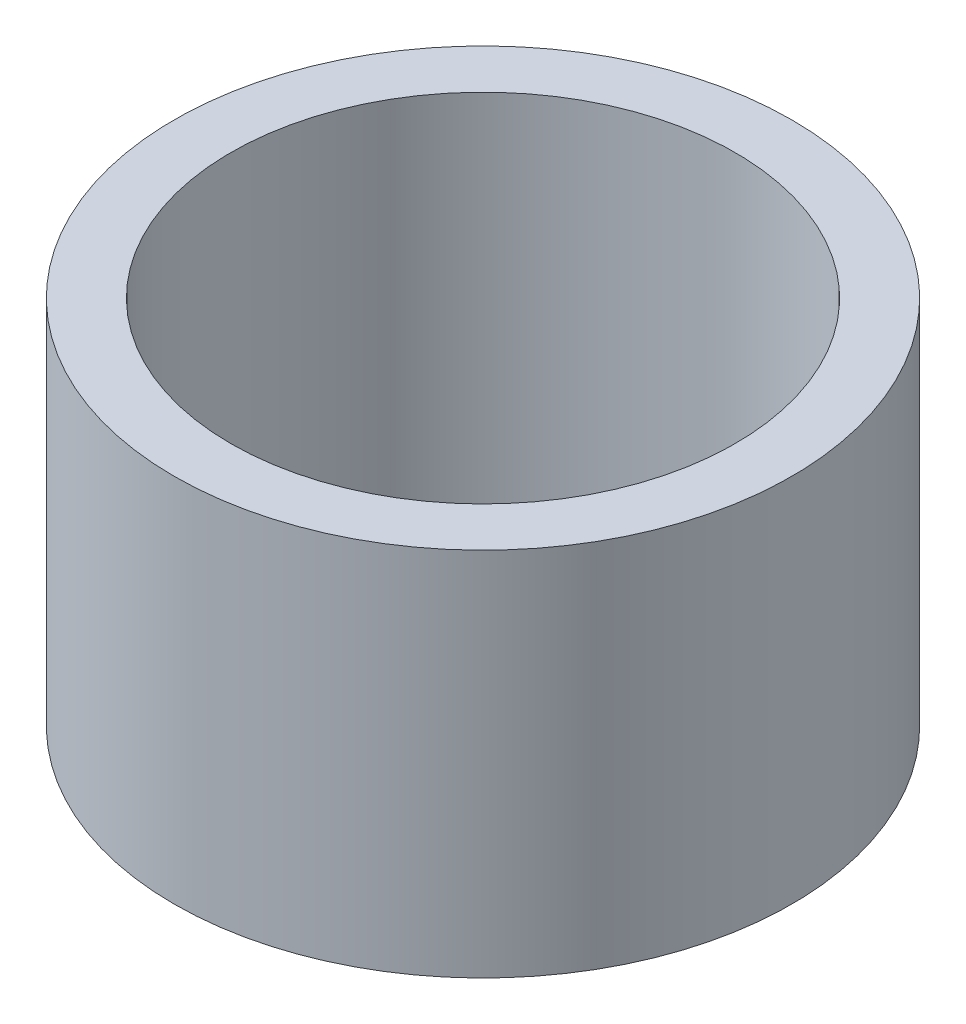
ISO-10303-21;
HEADER;
FILE_DESCRIPTION(('STEP AP214'),'2;1');
FILE_NAME('part.step','',(''),(''),'','','');
FILE_SCHEMA(('AUTOMOTIVE_DESIGN { 1 0 10303 214 1 1 1 1 }'));
ENDSEC;
DATA;
#1=APPLICATION_CONTEXT('core data for automotive mechanical design processes');
#2=APPLICATION_PROTOCOL_DEFINITION('international standard','automotive_design',2000,#1);
#3=PRODUCT_CONTEXT('',#1,'mechanical');
#4=PRODUCT('Part','Part','',(#3));
#5=PRODUCT_RELATED_PRODUCT_CATEGORY('part','',(#4));
#6=PRODUCT_DEFINITION_FORMATION('','',#4);
#7=PRODUCT_DEFINITION_CONTEXT('part definition',#1,'design');
#8=PRODUCT_DEFINITION('design','',#6,#7);
#9=PRODUCT_DEFINITION_SHAPE('','',#8);
#10=(LENGTH_UNIT() NAMED_UNIT(*) SI_UNIT(.MILLI.,.METRE.));
#11=(NAMED_UNIT(*) PLANE_ANGLE_UNIT() SI_UNIT($,.RADIAN.));
#12=(NAMED_UNIT(*) SI_UNIT($,.STERADIAN.) SOLID_ANGLE_UNIT());
#13=UNCERTAINTY_MEASURE_WITH_UNIT(LENGTH_MEASURE(1.E-05),#10,'distance_accuracy_value','');
#14=(GEOMETRIC_REPRESENTATION_CONTEXT(3) GLOBAL_UNCERTAINTY_ASSIGNED_CONTEXT((#13)) GLOBAL_UNIT_ASSIGNED_CONTEXT((#10,
#11,#12)) REPRESENTATION_CONTEXT('',''));
#15=CARTESIAN_POINT('',(0.,0.,0.));
#16=DIRECTION('',(0.,0.,1.));
#17=DIRECTION('',(1.,0.,0.));
#18=AXIS2_PLACEMENT_3D('',#15,#16,#17);
#19=CARTESIAN_POINT('',(0.,18.,0.));
#20=DIRECTION('',(0.,1.,0.));
#21=DIRECTION('',(0.,0.,1.));
#22=AXIS2_PLACEMENT_3D('',#19,#20,#21);
#23=PLANE('',#22);
#24=CARTESIAN_POINT('',(0.,18.,0.));
#25=DIRECTION('',(0.,1.,0.));
#26=DIRECTION('',(0.,0.,1.));
#27=AXIS2_PLACEMENT_3D('',#24,#25,#26);
#28=CIRCLE('',#27,30.);
#29=CARTESIAN_POINT('',(0.,18.,30.));
#30=VERTEX_POINT('',#29);
#31=EDGE_CURVE('E10',#30,#30,#28,.T.);
#32=ORIENTED_EDGE('',*,*,#31,.T.);
#33=EDGE_LOOP('',(#32));
#34=FACE_BOUND('',#33,.T.);
#35=CARTESIAN_POINT('',(0.,18.,0.));
#36=DIRECTION('',(0.,1.,0.));
#37=DIRECTION('',(0.,0.,1.));
#38=AXIS2_PLACEMENT_3D('',#35,#36,#37);
#39=CIRCLE('',#38,24.5);
#40=CARTESIAN_POINT('',(0.,18.,24.5));
#41=VERTEX_POINT('',#40);
#42=EDGE_CURVE('E43',#41,#41,#39,.T.);
#43=ORIENTED_EDGE('',*,*,#42,.F.);
#44=EDGE_LOOP('',(#43));
#45=FACE_BOUND('',#44,.T.);
#46=ADVANCED_FACE('F32',(#34,#45),#23,.T.);
#47=CARTESIAN_POINT('',(0.,-18.,0.));
#48=DIRECTION('',(0.,1.,0.));
#49=DIRECTION('',(0.,0.,1.));
#50=AXIS2_PLACEMENT_3D('',#47,#48,#49);
#51=PLANE('',#50);
#52=CARTESIAN_POINT('',(0.,-18.,0.));
#53=DIRECTION('',(0.,1.,0.));
#54=DIRECTION('',(0.,0.,1.));
#55=AXIS2_PLACEMENT_3D('',#52,#53,#54);
#56=CIRCLE('',#55,30.);
#57=CARTESIAN_POINT('',(0.,-18.,30.));
#58=VERTEX_POINT('',#57);
#59=EDGE_CURVE('E36',#58,#58,#56,.T.);
#60=ORIENTED_EDGE('',*,*,#59,.F.);
#61=EDGE_LOOP('',(#60));
#62=FACE_BOUND('',#61,.T.);
#63=CARTESIAN_POINT('',(0.,-18.,0.));
#64=DIRECTION('',(0.,1.,0.));
#65=DIRECTION('',(0.,0.,1.));
#66=AXIS2_PLACEMENT_3D('',#63,#64,#65);
#67=CIRCLE('',#66,24.5);
#68=CARTESIAN_POINT('',(0.,-18.,24.5));
#69=VERTEX_POINT('',#68);
#70=EDGE_CURVE('E45',#69,#69,#67,.T.);
#71=ORIENTED_EDGE('',*,*,#70,.T.);
#72=EDGE_LOOP('',(#71));
#73=FACE_BOUND('',#72,.T.);
#74=ADVANCED_FACE('F55',(#62,#73),#51,.F.);
#75=CARTESIAN_POINT('',(0.,18.,0.));
#76=DIRECTION('',(0.,-1.,0.));
#77=DIRECTION('',(0.,0.,-1.));
#78=AXIS2_PLACEMENT_3D('',#75,#76,#77);
#79=CYLINDRICAL_SURFACE('',#78,30.);
#80=ORIENTED_EDGE('',*,*,#31,.F.);
#81=EDGE_LOOP('',(#80));
#82=FACE_BOUND('',#81,.T.);
#83=ORIENTED_EDGE('',*,*,#59,.T.);
#84=EDGE_LOOP('',(#83));
#85=FACE_BOUND('',#84,.T.);
#86=ADVANCED_FACE('F34',(#82,#85),#79,.T.);
#87=CARTESIAN_POINT('',(0.,18.,0.));
#88=DIRECTION('',(0.,-1.,0.));
#89=DIRECTION('',(0.,0.,-1.));
#90=AXIS2_PLACEMENT_3D('',#87,#88,#89);
#91=CYLINDRICAL_SURFACE('',#90,24.5);
#92=ORIENTED_EDGE('',*,*,#42,.T.);
#93=EDGE_LOOP('',(#92));
#94=FACE_BOUND('',#93,.T.);
#95=ORIENTED_EDGE('',*,*,#70,.F.);
#96=EDGE_LOOP('',(#95));
#97=FACE_BOUND('',#96,.T.);
#98=ADVANCED_FACE('F51',(#94,#97),#91,.F.);
#99=CLOSED_SHELL('',(#46,#74,#86,#98));
#100=MANIFOLD_SOLID_BREP('B2',#99);
#101=ADVANCED_BREP_SHAPE_REPRESENTATION('',(#18,#100),#14);
#102=SHAPE_DEFINITION_REPRESENTATION(#9,#101);
ENDSEC;
END-ISO-10303-21;
